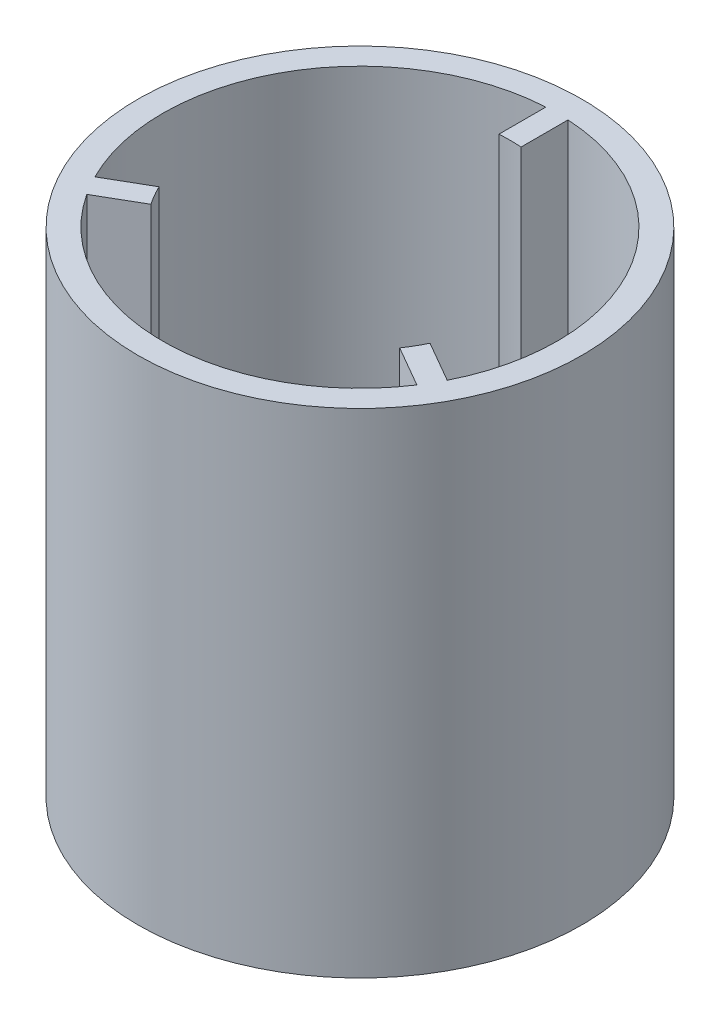
ISO-10303-21;
HEADER;
FILE_DESCRIPTION(('STEP AP214'),'2;1');
FILE_NAME('part.step','',(''),(''),'','','');
FILE_SCHEMA(('AUTOMOTIVE_DESIGN { 1 0 10303 214 1 1 1 1 }'));
ENDSEC;
DATA;
#1=APPLICATION_CONTEXT('core data for automotive mechanical design processes');
#2=APPLICATION_PROTOCOL_DEFINITION('international standard','automotive_design',2000,#1);
#3=PRODUCT_CONTEXT('',#1,'mechanical');
#4=PRODUCT('Part','Part','',(#3));
#5=PRODUCT_RELATED_PRODUCT_CATEGORY('part','',(#4));
#6=PRODUCT_DEFINITION_FORMATION('','',#4);
#7=PRODUCT_DEFINITION_CONTEXT('part definition',#1,'design');
#8=PRODUCT_DEFINITION('design','',#6,#7);
#9=PRODUCT_DEFINITION_SHAPE('','',#8);
#10=(LENGTH_UNIT() NAMED_UNIT(*) SI_UNIT(.MILLI.,.METRE.));
#11=(NAMED_UNIT(*) PLANE_ANGLE_UNIT() SI_UNIT($,.RADIAN.));
#12=(NAMED_UNIT(*) SI_UNIT($,.STERADIAN.) SOLID_ANGLE_UNIT());
#13=UNCERTAINTY_MEASURE_WITH_UNIT(LENGTH_MEASURE(1.E-05),#10,'distance_accuracy_value','');
#14=(GEOMETRIC_REPRESENTATION_CONTEXT(3) GLOBAL_UNCERTAINTY_ASSIGNED_CONTEXT((#13)) GLOBAL_UNIT_ASSIGNED_CONTEXT((#10,
#11,#12)) REPRESENTATION_CONTEXT('',''));
#15=CARTESIAN_POINT('',(0.,0.,0.));
#16=DIRECTION('',(0.,0.,1.));
#17=DIRECTION('',(1.,0.,0.));
#18=AXIS2_PLACEMENT_3D('',#15,#16,#17);
#19=CARTESIAN_POINT('',(0.,10.,0.));
#20=DIRECTION('',(0.,-1.,0.));
#21=DIRECTION('',(0.,0.,-1.));
#22=AXIS2_PLACEMENT_3D('',#19,#20,#21);
#23=CYLINDRICAL_SURFACE('',#22,4.);
#24=CARTESIAN_POINT('',(0.,0.,0.));
#25=DIRECTION('',(0.,1.,0.));
#26=DIRECTION('',(0.,0.,1.));
#27=AXIS2_PLACEMENT_3D('',#24,#25,#26);
#28=CIRCLE('',#27,4.);
#29=CARTESIAN_POINT('',(-0.225,0.,-3.99366686141947));
#30=VERTEX_POINT('',#29);
#31=CARTESIAN_POINT('',(-3.57111695624132,0.,1.80197771485824));
#32=VERTEX_POINT('',#31);
#33=EDGE_CURVE('E257',#30,#32,#28,.T.);
#34=ORIENTED_EDGE('',*,*,#33,.F.);
#35=DIRECTION('',(0.,1.,0.));
#36=VECTOR('',#35,1.);
#37=CARTESIAN_POINT('',(-0.225,0.,-3.99366686141947));
#38=LINE('',#37,#36);
#39=CARTESIAN_POINT('',(-0.225,10.,-3.99366686141947));
#40=VERTEX_POINT('',#39);
#41=EDGE_CURVE('E185',#30,#40,#38,.T.);
#42=ORIENTED_EDGE('',*,*,#41,.T.);
#43=CARTESIAN_POINT('',(0.,10.,0.));
#44=DIRECTION('',(0.,1.,0.));
#45=DIRECTION('',(0.,0.,1.));
#46=AXIS2_PLACEMENT_3D('',#43,#44,#45);
#47=CIRCLE('',#46,4.);
#48=CARTESIAN_POINT('',(-3.57111695624132,10.,1.80197771485824));
#49=VERTEX_POINT('',#48);
#50=EDGE_CURVE('E260',#40,#49,#47,.T.);
#51=ORIENTED_EDGE('',*,*,#50,.T.);
#52=DIRECTION('',(0.,1.,0.));
#53=VECTOR('',#52,1.);
#54=CARTESIAN_POINT('',(-3.57111695624132,0.,1.80197771485824));
#55=LINE('',#54,#53);
#56=EDGE_CURVE('E248',#32,#49,#55,.T.);
#57=ORIENTED_EDGE('',*,*,#56,.F.);
#58=EDGE_LOOP('',(#34,#42,#51,#57));
#59=FACE_BOUND('',#58,.T.);
#60=ADVANCED_FACE('F50',(#59),#23,.F.);
#61=DIRECTION('',(0.,1.,0.));
#62=VECTOR('',#61,1.);
#63=CARTESIAN_POINT('',(0.225,0.,-3.99366686141947));
#64=LINE('',#63,#62);
#65=CARTESIAN_POINT('',(0.225,0.,-3.99366686141947));
#66=VERTEX_POINT('',#65);
#67=CARTESIAN_POINT('',(0.225,10.,-3.99366686141947));
#68=VERTEX_POINT('',#67);
#69=EDGE_CURVE('E147',#66,#68,#64,.T.);
#70=ORIENTED_EDGE('',*,*,#69,.F.);
#71=CARTESIAN_POINT('',(3.57111695624132,0.,1.80197771485823));
#72=VERTEX_POINT('',#71);
#73=EDGE_CURVE('E164',#72,#66,#28,.T.);
#74=ORIENTED_EDGE('',*,*,#73,.F.);
#75=DIRECTION('',(0.,1.,0.));
#76=VECTOR('',#75,1.);
#77=CARTESIAN_POINT('',(3.57111695624132,0.,1.80197771485823));
#78=LINE('',#77,#76);
#79=CARTESIAN_POINT('',(3.57111695624132,10.,1.80197771485823));
#80=VERTEX_POINT('',#79);
#81=EDGE_CURVE('E213',#72,#80,#78,.T.);
#82=ORIENTED_EDGE('',*,*,#81,.T.);
#83=EDGE_CURVE('E256',#80,#68,#47,.T.);
#84=ORIENTED_EDGE('',*,*,#83,.T.);
#85=EDGE_LOOP('',(#70,#74,#82,#84));
#86=FACE_BOUND('',#85,.T.);
#87=ADVANCED_FACE('F281',(#86),#23,.F.);
#88=CARTESIAN_POINT('',(0.,10.,0.));
#89=DIRECTION('',(0.,1.,0.));
#90=DIRECTION('',(0.,0.,1.));
#91=AXIS2_PLACEMENT_3D('',#88,#89,#90);
#92=PLANE('',#91);
#93=CARTESIAN_POINT('',(0.,10.,0.));
#94=DIRECTION('',(0.,1.,0.));
#95=DIRECTION('',(0.,0.,1.));
#96=AXIS2_PLACEMENT_3D('',#93,#94,#95);
#97=CIRCLE('',#96,4.5);
#98=CARTESIAN_POINT('',(0.,10.,4.5));
#99=VERTEX_POINT('',#98);
#100=EDGE_CURVE('E11',#99,#99,#97,.T.);
#101=ORIENTED_EDGE('',*,*,#100,.T.);
#102=EDGE_LOOP('',(#101));
#103=FACE_BOUND('',#102,.T.);
#104=ORIENTED_EDGE('',*,*,#83,.F.);
#105=DIRECTION('',(0.866025403784439,0.,0.5));
#106=VECTOR('',#105,1.);
#107=CARTESIAN_POINT('',(0.1125,10.,-0.194855715851499));
#108=LINE('',#107,#106);
#109=CARTESIAN_POINT('',(2.74668037537295,10.,1.32598903296411));
#110=VERTEX_POINT('',#109);
#111=EDGE_CURVE('E195',#110,#80,#108,.T.);
#112=ORIENTED_EDGE('',*,*,#111,.F.);
#113=CARTESIAN_POINT('',(0.,10.,0.));
#114=DIRECTION('',(0.,1.,0.));
#115=DIRECTION('',(0.,0.,1.));
#116=AXIS2_PLACEMENT_3D('',#113,#114,#115);
#117=CIRCLE('',#116,3.05);
#118=CARTESIAN_POINT('',(2.52168037537296,10.,1.7157004646671));
#119=VERTEX_POINT('',#118);
#120=EDGE_CURVE('E200',#119,#110,#117,.T.);
#121=ORIENTED_EDGE('',*,*,#120,.F.);
#122=DIRECTION('',(0.866025403784439,0.,0.5));
#123=VECTOR('',#122,1.);
#124=CARTESIAN_POINT('',(-0.1125,10.,0.194855715851499));
#125=LINE('',#124,#123);
#126=CARTESIAN_POINT('',(3.34611695624133,10.,2.19168914656123));
#127=VERTEX_POINT('',#126);
#128=EDGE_CURVE('E201',#119,#127,#125,.T.);
#129=ORIENTED_EDGE('',*,*,#128,.T.);
#130=CARTESIAN_POINT('',(-3.34611695624132,10.,2.19168914656123));
#131=VERTEX_POINT('',#130);
#132=EDGE_CURVE('E251',#131,#127,#47,.T.);
#133=ORIENTED_EDGE('',*,*,#132,.F.);
#134=DIRECTION('',(-0.866025403784438,0.,0.5));
#135=VECTOR('',#134,1.);
#136=CARTESIAN_POINT('',(0.1125,10.,0.194855715851499));
#137=LINE('',#136,#135);
#138=CARTESIAN_POINT('',(-2.52168037537295,10.,1.7157004646671));
#139=VERTEX_POINT('',#138);
#140=EDGE_CURVE('E64',#139,#131,#137,.T.);
#141=ORIENTED_EDGE('',*,*,#140,.F.);
#142=CARTESIAN_POINT('',(0.,10.,0.));
#143=DIRECTION('',(0.,1.,0.));
#144=DIRECTION('',(0.,0.,1.));
#145=AXIS2_PLACEMENT_3D('',#142,#143,#144);
#146=CIRCLE('',#145,3.05);
#147=CARTESIAN_POINT('',(-2.74668037537295,10.,1.32598903296411));
#148=VERTEX_POINT('',#147);
#149=EDGE_CURVE('E233',#148,#139,#146,.T.);
#150=ORIENTED_EDGE('',*,*,#149,.F.);
#151=DIRECTION('',(-0.866025403784438,0.,0.5));
#152=VECTOR('',#151,1.);
#153=CARTESIAN_POINT('',(-0.1125,10.,-0.194855715851499));
#154=LINE('',#153,#152);
#155=EDGE_CURVE('E240',#148,#49,#154,.T.);
#156=ORIENTED_EDGE('',*,*,#155,.T.);
#157=ORIENTED_EDGE('',*,*,#50,.F.);
#158=DIRECTION('',(0.,0.,-1.));
#159=VECTOR('',#158,1.);
#160=CARTESIAN_POINT('',(-0.225,10.,0.));
#161=LINE('',#160,#159);
#162=CARTESIAN_POINT('',(-0.225,10.,-3.04168949763121));
#163=VERTEX_POINT('',#162);
#164=EDGE_CURVE('E72',#163,#40,#161,.T.);
#165=ORIENTED_EDGE('',*,*,#164,.F.);
#166=CARTESIAN_POINT('',(0.,10.,0.));
#167=DIRECTION('',(0.,1.,0.));
#168=DIRECTION('',(0.,0.,1.));
#169=AXIS2_PLACEMENT_3D('',#166,#167,#168);
#170=CIRCLE('',#169,3.05);
#171=CARTESIAN_POINT('',(0.225,10.,-3.04168949763121));
#172=VERTEX_POINT('',#171);
#173=EDGE_CURVE('E172',#172,#163,#170,.T.);
#174=ORIENTED_EDGE('',*,*,#173,.F.);
#175=DIRECTION('',(0.,0.,-1.));
#176=VECTOR('',#175,1.);
#177=CARTESIAN_POINT('',(0.225,10.,0.));
#178=LINE('',#177,#176);
#179=EDGE_CURVE('E144',#172,#68,#178,.T.);
#180=ORIENTED_EDGE('',*,*,#179,.T.);
#181=EDGE_LOOP('',(#104,#112,#121,#129,#133,#141,#150,#156,#157,#165,#174,#180));
#182=FACE_BOUND('',#181,.T.);
#183=ADVANCED_FACE('F277',(#103,#182),#92,.T.);
#184=CARTESIAN_POINT('',(0.,0.,0.));
#185=DIRECTION('',(0.,1.,0.));
#186=DIRECTION('',(0.,0.,1.));
#187=AXIS2_PLACEMENT_3D('',#184,#185,#186);
#188=PLANE('',#187);
#189=CARTESIAN_POINT('',(0.,0.,0.));
#190=DIRECTION('',(0.,1.,0.));
#191=DIRECTION('',(0.,0.,1.));
#192=AXIS2_PLACEMENT_3D('',#189,#190,#191);
#193=CIRCLE('',#192,4.5);
#194=CARTESIAN_POINT('',(0.,0.,4.5));
#195=VERTEX_POINT('',#194);
#196=EDGE_CURVE('E51',#195,#195,#193,.T.);
#197=ORIENTED_EDGE('',*,*,#196,.F.);
#198=EDGE_LOOP('',(#197));
#199=FACE_BOUND('',#198,.T.);
#200=CARTESIAN_POINT('',(-3.34611695624132,0.,2.19168914656123));
#201=VERTEX_POINT('',#200);
#202=CARTESIAN_POINT('',(3.34611695624133,0.,2.19168914656123));
#203=VERTEX_POINT('',#202);
#204=EDGE_CURVE('E182',#201,#203,#28,.T.);
#205=ORIENTED_EDGE('',*,*,#204,.T.);
#206=DIRECTION('',(0.866025403784439,0.,0.5));
#207=VECTOR('',#206,1.);
#208=CARTESIAN_POINT('',(-0.1125,0.,0.194855715851499));
#209=LINE('',#208,#207);
#210=CARTESIAN_POINT('',(2.52168037537296,0.,1.7157004646671));
#211=VERTEX_POINT('',#210);
#212=EDGE_CURVE('E191',#211,#203,#209,.T.);
#213=ORIENTED_EDGE('',*,*,#212,.F.);
#214=CARTESIAN_POINT('',(0.,0.,0.));
#215=DIRECTION('',(0.,1.,0.));
#216=DIRECTION('',(0.,0.,1.));
#217=AXIS2_PLACEMENT_3D('',#214,#215,#216);
#218=CIRCLE('',#217,3.05);
#219=CARTESIAN_POINT('',(2.74668037537295,0.,1.32598903296411));
#220=VERTEX_POINT('',#219);
#221=EDGE_CURVE('E190',#211,#220,#218,.T.);
#222=ORIENTED_EDGE('',*,*,#221,.T.);
#223=DIRECTION('',(0.866025403784439,0.,0.5));
#224=VECTOR('',#223,1.);
#225=CARTESIAN_POINT('',(0.1125,0.,-0.194855715851499));
#226=LINE('',#225,#224);
#227=EDGE_CURVE('E194',#220,#72,#226,.T.);
#228=ORIENTED_EDGE('',*,*,#227,.T.);
#229=ORIENTED_EDGE('',*,*,#73,.T.);
#230=DIRECTION('',(0.,0.,-1.));
#231=VECTOR('',#230,1.);
#232=CARTESIAN_POINT('',(0.225,0.,0.));
#233=LINE('',#232,#231);
#234=CARTESIAN_POINT('',(0.225,0.,-3.04168949763121));
#235=VERTEX_POINT('',#234);
#236=EDGE_CURVE('E142',#235,#66,#233,.T.);
#237=ORIENTED_EDGE('',*,*,#236,.F.);
#238=CARTESIAN_POINT('',(0.,0.,0.));
#239=DIRECTION('',(0.,1.,0.));
#240=DIRECTION('',(0.,0.,1.));
#241=AXIS2_PLACEMENT_3D('',#238,#239,#240);
#242=CIRCLE('',#241,3.05);
#243=CARTESIAN_POINT('',(-0.225,0.,-3.04168949763121));
#244=VERTEX_POINT('',#243);
#245=EDGE_CURVE('E154',#235,#244,#242,.T.);
#246=ORIENTED_EDGE('',*,*,#245,.T.);
#247=DIRECTION('',(0.,0.,-1.));
#248=VECTOR('',#247,1.);
#249=CARTESIAN_POINT('',(-0.225,0.,0.));
#250=LINE('',#249,#248);
#251=EDGE_CURVE('E151',#244,#30,#250,.T.);
#252=ORIENTED_EDGE('',*,*,#251,.T.);
#253=ORIENTED_EDGE('',*,*,#33,.T.);
#254=DIRECTION('',(-0.866025403784438,0.,0.5));
#255=VECTOR('',#254,1.);
#256=CARTESIAN_POINT('',(-0.1125,0.,-0.194855715851499));
#257=LINE('',#256,#255);
#258=CARTESIAN_POINT('',(-2.74668037537295,0.,1.32598903296411));
#259=VERTEX_POINT('',#258);
#260=EDGE_CURVE('E227',#259,#32,#257,.T.);
#261=ORIENTED_EDGE('',*,*,#260,.F.);
#262=CARTESIAN_POINT('',(0.,0.,0.));
#263=DIRECTION('',(0.,1.,0.));
#264=DIRECTION('',(0.,0.,1.));
#265=AXIS2_PLACEMENT_3D('',#262,#263,#264);
#266=CIRCLE('',#265,3.05);
#267=CARTESIAN_POINT('',(-2.52168037537295,0.,1.7157004646671));
#268=VERTEX_POINT('',#267);
#269=EDGE_CURVE('E225',#259,#268,#266,.T.);
#270=ORIENTED_EDGE('',*,*,#269,.T.);
#271=DIRECTION('',(-0.866025403784438,0.,0.5));
#272=VECTOR('',#271,1.);
#273=CARTESIAN_POINT('',(0.1125,0.,0.194855715851499));
#274=LINE('',#273,#272);
#275=EDGE_CURVE('E226',#268,#201,#274,.T.);
#276=ORIENTED_EDGE('',*,*,#275,.T.);
#277=EDGE_LOOP('',(#205,#213,#222,#228,#229,#237,#246,#252,#253,#261,#270,#276));
#278=FACE_BOUND('',#277,.T.);
#279=ADVANCED_FACE('F162',(#199,#278),#188,.F.);
#280=CARTESIAN_POINT('',(0.,10.,0.));
#281=DIRECTION('',(0.,-1.,0.));
#282=DIRECTION('',(0.,0.,-1.));
#283=AXIS2_PLACEMENT_3D('',#280,#281,#282);
#284=CYLINDRICAL_SURFACE('',#283,4.5);
#285=ORIENTED_EDGE('',*,*,#100,.F.);
#286=EDGE_LOOP('',(#285));
#287=FACE_BOUND('',#286,.T.);
#288=ORIENTED_EDGE('',*,*,#196,.T.);
#289=EDGE_LOOP('',(#288));
#290=FACE_BOUND('',#289,.T.);
#291=ADVANCED_FACE('F47',(#287,#290),#284,.T.);
#292=DIRECTION('',(0.,1.,0.));
#293=VECTOR('',#292,1.);
#294=CARTESIAN_POINT('',(3.34611695624133,0.,2.19168914656123));
#295=LINE('',#294,#293);
#296=EDGE_CURVE('E220',#203,#127,#295,.T.);
#297=ORIENTED_EDGE('',*,*,#296,.F.);
#298=ORIENTED_EDGE('',*,*,#204,.F.);
#299=DIRECTION('',(0.,1.,0.));
#300=VECTOR('',#299,1.);
#301=CARTESIAN_POINT('',(-3.34611695624132,0.,2.19168914656123));
#302=LINE('',#301,#300);
#303=EDGE_CURVE('E243',#201,#131,#302,.T.);
#304=ORIENTED_EDGE('',*,*,#303,.T.);
#305=ORIENTED_EDGE('',*,*,#132,.T.);
#306=EDGE_LOOP('',(#297,#298,#304,#305));
#307=FACE_BOUND('',#306,.T.);
#308=ADVANCED_FACE('F285',(#307),#23,.F.);
#309=CARTESIAN_POINT('',(0.,0.,0.));
#310=DIRECTION('',(0.,1.,0.));
#311=DIRECTION('',(0.,0.,1.));
#312=AXIS2_PLACEMENT_3D('',#309,#310,#311);
#313=CYLINDRICAL_SURFACE('',#312,3.05);
#314=ORIENTED_EDGE('',*,*,#149,.T.);
#315=DIRECTION('',(0.,1.,0.));
#316=VECTOR('',#315,1.);
#317=CARTESIAN_POINT('',(-2.52168037537295,0.,1.7157004646671));
#318=LINE('',#317,#316);
#319=EDGE_CURVE('E204',#268,#139,#318,.T.);
#320=ORIENTED_EDGE('',*,*,#319,.F.);
#321=ORIENTED_EDGE('',*,*,#269,.F.);
#322=DIRECTION('',(0.,1.,0.));
#323=VECTOR('',#322,1.);
#324=CARTESIAN_POINT('',(-2.74668037537295,0.,1.32598903296411));
#325=LINE('',#324,#323);
#326=EDGE_CURVE('E235',#259,#148,#325,.T.);
#327=ORIENTED_EDGE('',*,*,#326,.T.);
#328=EDGE_LOOP('',(#314,#320,#321,#327));
#329=FACE_BOUND('',#328,.T.);
#330=ADVANCED_FACE('F297',(#329),#313,.F.);
#331=CARTESIAN_POINT('',(0.1125,0.,0.194855715851499));
#332=DIRECTION('',(-0.5,0.,-0.866025403784438));
#333=DIRECTION('',(-0.866025403784438,0.,0.5));
#334=AXIS2_PLACEMENT_3D('',#331,#332,#333);
#335=PLANE('',#334);
#336=ORIENTED_EDGE('',*,*,#140,.T.);
#337=ORIENTED_EDGE('',*,*,#303,.F.);
#338=ORIENTED_EDGE('',*,*,#275,.F.);
#339=ORIENTED_EDGE('',*,*,#319,.T.);
#340=EDGE_LOOP('',(#336,#337,#338,#339));
#341=FACE_BOUND('',#340,.T.);
#342=ADVANCED_FACE('F296',(#341),#335,.F.);
#343=CARTESIAN_POINT('',(-0.1125,0.,-0.194855715851499));
#344=DIRECTION('',(-0.5,0.,-0.866025403784438));
#345=DIRECTION('',(-0.866025403784438,0.,0.5));
#346=AXIS2_PLACEMENT_3D('',#343,#344,#345);
#347=PLANE('',#346);
#348=ORIENTED_EDGE('',*,*,#155,.F.);
#349=ORIENTED_EDGE('',*,*,#326,.F.);
#350=ORIENTED_EDGE('',*,*,#260,.T.);
#351=ORIENTED_EDGE('',*,*,#56,.T.);
#352=EDGE_LOOP('',(#348,#349,#350,#351));
#353=FACE_BOUND('',#352,.T.);
#354=ADVANCED_FACE('F325',(#353),#347,.T.);
#355=CARTESIAN_POINT('',(0.,0.,0.));
#356=DIRECTION('',(0.,1.,0.));
#357=DIRECTION('',(0.,0.,1.));
#358=AXIS2_PLACEMENT_3D('',#355,#356,#357);
#359=CYLINDRICAL_SURFACE('',#358,3.05);
#360=ORIENTED_EDGE('',*,*,#120,.T.);
#361=DIRECTION('',(0.,1.,0.));
#362=VECTOR('',#361,1.);
#363=CARTESIAN_POINT('',(2.74668037537295,0.,1.32598903296411));
#364=LINE('',#363,#362);
#365=EDGE_CURVE('E171',#220,#110,#364,.T.);
#366=ORIENTED_EDGE('',*,*,#365,.F.);
#367=ORIENTED_EDGE('',*,*,#221,.F.);
#368=DIRECTION('',(0.,1.,0.));
#369=VECTOR('',#368,1.);
#370=CARTESIAN_POINT('',(2.52168037537296,0.,1.7157004646671));
#371=LINE('',#370,#369);
#372=EDGE_CURVE('E196',#211,#119,#371,.T.);
#373=ORIENTED_EDGE('',*,*,#372,.T.);
#374=EDGE_LOOP('',(#360,#366,#367,#373));
#375=FACE_BOUND('',#374,.T.);
#376=ADVANCED_FACE('F313',(#375),#359,.F.);
#377=CARTESIAN_POINT('',(0.1125,0.,-0.194855715851499));
#378=DIRECTION('',(-0.5,0.,0.866025403784439));
#379=DIRECTION('',(0.866025403784439,0.,0.5));
#380=AXIS2_PLACEMENT_3D('',#377,#378,#379);
#381=PLANE('',#380);
#382=ORIENTED_EDGE('',*,*,#111,.T.);
#383=ORIENTED_EDGE('',*,*,#81,.F.);
#384=ORIENTED_EDGE('',*,*,#227,.F.);
#385=ORIENTED_EDGE('',*,*,#365,.T.);
#386=EDGE_LOOP('',(#382,#383,#384,#385));
#387=FACE_BOUND('',#386,.T.);
#388=ADVANCED_FACE('F312',(#387),#381,.F.);
#389=CARTESIAN_POINT('',(-0.1125,0.,0.194855715851499));
#390=DIRECTION('',(-0.5,0.,0.866025403784439));
#391=DIRECTION('',(0.866025403784439,0.,0.5));
#392=AXIS2_PLACEMENT_3D('',#389,#390,#391);
#393=PLANE('',#392);
#394=ORIENTED_EDGE('',*,*,#128,.F.);
#395=ORIENTED_EDGE('',*,*,#372,.F.);
#396=ORIENTED_EDGE('',*,*,#212,.T.);
#397=ORIENTED_EDGE('',*,*,#296,.T.);
#398=EDGE_LOOP('',(#394,#395,#396,#397));
#399=FACE_BOUND('',#398,.T.);
#400=ADVANCED_FACE('F304',(#399),#393,.T.);
#401=CARTESIAN_POINT('',(0.,0.,0.));
#402=DIRECTION('',(0.,1.,0.));
#403=DIRECTION('',(0.,0.,1.));
#404=AXIS2_PLACEMENT_3D('',#401,#402,#403);
#405=CYLINDRICAL_SURFACE('',#404,3.05);
#406=ORIENTED_EDGE('',*,*,#173,.T.);
#407=DIRECTION('',(0.,1.,0.));
#408=VECTOR('',#407,1.);
#409=CARTESIAN_POINT('',(-0.225,0.,-3.04168949763121));
#410=LINE('',#409,#408);
#411=EDGE_CURVE('E160',#244,#163,#410,.T.);
#412=ORIENTED_EDGE('',*,*,#411,.F.);
#413=ORIENTED_EDGE('',*,*,#245,.F.);
#414=DIRECTION('',(0.,1.,0.));
#415=VECTOR('',#414,1.);
#416=CARTESIAN_POINT('',(0.225,0.,-3.04168949763121));
#417=LINE('',#416,#415);
#418=EDGE_CURVE('E138',#235,#172,#417,.T.);
#419=ORIENTED_EDGE('',*,*,#418,.T.);
#420=EDGE_LOOP('',(#406,#412,#413,#419));
#421=FACE_BOUND('',#420,.T.);
#422=ADVANCED_FACE('F156',(#421),#405,.F.);
#423=CARTESIAN_POINT('',(-0.225,0.,0.));
#424=DIRECTION('',(1.,0.,0.));
#425=DIRECTION('',(0.,0.,-1.));
#426=AXIS2_PLACEMENT_3D('',#423,#424,#425);
#427=PLANE('',#426);
#428=ORIENTED_EDGE('',*,*,#164,.T.);
#429=ORIENTED_EDGE('',*,*,#41,.F.);
#430=ORIENTED_EDGE('',*,*,#251,.F.);
#431=ORIENTED_EDGE('',*,*,#411,.T.);
#432=EDGE_LOOP('',(#428,#429,#430,#431));
#433=FACE_BOUND('',#432,.T.);
#434=ADVANCED_FACE('F320',(#433),#427,.F.);
#435=CARTESIAN_POINT('',(0.225,0.,0.));
#436=DIRECTION('',(1.,0.,0.));
#437=DIRECTION('',(0.,0.,-1.));
#438=AXIS2_PLACEMENT_3D('',#435,#436,#437);
#439=PLANE('',#438);
#440=ORIENTED_EDGE('',*,*,#179,.F.);
#441=ORIENTED_EDGE('',*,*,#418,.F.);
#442=ORIENTED_EDGE('',*,*,#236,.T.);
#443=ORIENTED_EDGE('',*,*,#69,.T.);
#444=EDGE_LOOP('',(#440,#441,#442,#443));
#445=FACE_BOUND('',#444,.T.);
#446=ADVANCED_FACE('F139',(#445),#439,.T.);
#447=CLOSED_SHELL('',(#60,#87,#183,#279,#291,#308,#330,#342,#354,#376,#388,#400,#422,#434,#446));
#448=MANIFOLD_SOLID_BREP('B2',#447);
#449=ADVANCED_BREP_SHAPE_REPRESENTATION('',(#18,#448),#14);
#450=SHAPE_DEFINITION_REPRESENTATION(#9,#449);
ENDSEC;
END-ISO-10303-21;
